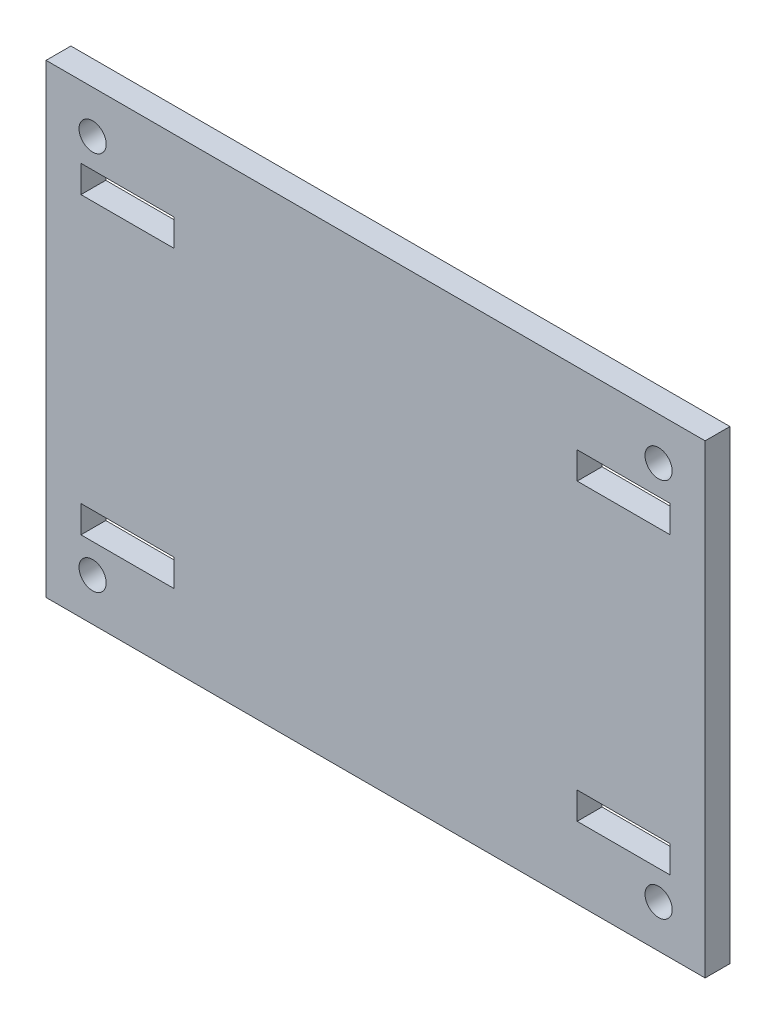
ISO-10303-21;
HEADER;
FILE_DESCRIPTION(('STEP AP214'),'2;1');
FILE_NAME('part.step','',(''),(''),'','','');
FILE_SCHEMA(('AUTOMOTIVE_DESIGN { 1 0 10303 214 1 1 1 1 }'));
ENDSEC;
DATA;
#1=APPLICATION_CONTEXT('core data for automotive mechanical design processes');
#2=APPLICATION_PROTOCOL_DEFINITION('international standard','automotive_design',2000,#1);
#3=PRODUCT_CONTEXT('',#1,'mechanical');
#4=PRODUCT('Part','Part','',(#3));
#5=PRODUCT_RELATED_PRODUCT_CATEGORY('part','',(#4));
#6=PRODUCT_DEFINITION_FORMATION('','',#4);
#7=PRODUCT_DEFINITION_CONTEXT('part definition',#1,'design');
#8=PRODUCT_DEFINITION('design','',#6,#7);
#9=PRODUCT_DEFINITION_SHAPE('','',#8);
#10=(LENGTH_UNIT() NAMED_UNIT(*) SI_UNIT(.MILLI.,.METRE.));
#11=(NAMED_UNIT(*) PLANE_ANGLE_UNIT() SI_UNIT($,.RADIAN.));
#12=(NAMED_UNIT(*) SI_UNIT($,.STERADIAN.) SOLID_ANGLE_UNIT());
#13=UNCERTAINTY_MEASURE_WITH_UNIT(LENGTH_MEASURE(1.E-05),#10,'distance_accuracy_value','');
#14=(GEOMETRIC_REPRESENTATION_CONTEXT(3) GLOBAL_UNCERTAINTY_ASSIGNED_CONTEXT((#13)) GLOBAL_UNIT_ASSIGNED_CONTEXT((#10,
#11,#12)) REPRESENTATION_CONTEXT('',''));
#15=CARTESIAN_POINT('',(0.,0.,0.));
#16=DIRECTION('',(0.,0.,1.));
#17=DIRECTION('',(1.,0.,0.));
#18=AXIS2_PLACEMENT_3D('',#15,#16,#17);
#19=CARTESIAN_POINT('',(0.,0.,3.2));
#20=DIRECTION('',(0.,0.,-1.));
#21=DIRECTION('',(-1.,0.,0.));
#22=AXIS2_PLACEMENT_3D('',#19,#20,#21);
#23=PLANE('',#22);
#24=DIRECTION('',(0.,-1.,0.));
#25=VECTOR('',#24,1.);
#26=CARTESIAN_POINT('',(-38.,-20.75,3.2));
#27=LINE('',#26,#25);
#28=CARTESIAN_POINT('',(-38.,-17.25,3.2));
#29=VERTEX_POINT('',#28);
#30=CARTESIAN_POINT('',(-38.,-20.75,3.2));
#31=VERTEX_POINT('',#30);
#32=EDGE_CURVE('E214',#29,#31,#27,.T.);
#33=ORIENTED_EDGE('',*,*,#32,.F.);
#34=DIRECTION('',(-1.,0.,0.));
#35=VECTOR('',#34,1.);
#36=CARTESIAN_POINT('',(-38.,-17.25,3.2));
#37=LINE('',#36,#35);
#38=CARTESIAN_POINT('',(-26.,-17.25,3.2));
#39=VERTEX_POINT('',#38);
#40=EDGE_CURVE('E223',#39,#29,#37,.T.);
#41=ORIENTED_EDGE('',*,*,#40,.F.);
#42=DIRECTION('',(0.,1.,0.));
#43=VECTOR('',#42,1.);
#44=CARTESIAN_POINT('',(-26.,-20.75,3.2));
#45=LINE('',#44,#43);
#46=CARTESIAN_POINT('',(-26.,-20.75,3.2));
#47=VERTEX_POINT('',#46);
#48=EDGE_CURVE('E217',#47,#39,#45,.T.);
#49=ORIENTED_EDGE('',*,*,#48,.F.);
#50=DIRECTION('',(1.,0.,0.));
#51=VECTOR('',#50,1.);
#52=CARTESIAN_POINT('',(-38.,-20.75,3.2));
#53=LINE('',#52,#51);
#54=EDGE_CURVE('E220',#31,#47,#53,.T.);
#55=ORIENTED_EDGE('',*,*,#54,.F.);
#56=EDGE_LOOP('',(#33,#41,#49,#55));
#57=FACE_BOUND('',#56,.T.);
#58=DIRECTION('',(0.,-1.,0.));
#59=VECTOR('',#58,1.);
#60=CARTESIAN_POINT('',(-38.,17.25,3.2));
#61=LINE('',#60,#59);
#62=CARTESIAN_POINT('',(-38.,20.75,3.2));
#63=VERTEX_POINT('',#62);
#64=CARTESIAN_POINT('',(-38.,17.25,3.2));
#65=VERTEX_POINT('',#64);
#66=EDGE_CURVE('E280',#63,#65,#61,.T.);
#67=ORIENTED_EDGE('',*,*,#66,.F.);
#68=DIRECTION('',(-1.,0.,0.));
#69=VECTOR('',#68,1.);
#70=CARTESIAN_POINT('',(-38.,20.75,3.2));
#71=LINE('',#70,#69);
#72=CARTESIAN_POINT('',(-26.,20.75,3.2));
#73=VERTEX_POINT('',#72);
#74=EDGE_CURVE('E283',#73,#63,#71,.T.);
#75=ORIENTED_EDGE('',*,*,#74,.F.);
#76=DIRECTION('',(0.,1.,0.));
#77=VECTOR('',#76,1.);
#78=CARTESIAN_POINT('',(-26.,17.25,3.2));
#79=LINE('',#78,#77);
#80=CARTESIAN_POINT('',(-26.,17.25,3.2));
#81=VERTEX_POINT('',#80);
#82=EDGE_CURVE('E285',#81,#73,#79,.T.);
#83=ORIENTED_EDGE('',*,*,#82,.F.);
#84=DIRECTION('',(1.,0.,0.));
#85=VECTOR('',#84,1.);
#86=CARTESIAN_POINT('',(-38.,17.25,3.2));
#87=LINE('',#86,#85);
#88=EDGE_CURVE('E278',#65,#81,#87,.T.);
#89=ORIENTED_EDGE('',*,*,#88,.F.);
#90=EDGE_LOOP('',(#67,#75,#83,#89));
#91=FACE_BOUND('',#90,.T.);
#92=DIRECTION('',(0.,-1.,0.));
#93=VECTOR('',#92,1.);
#94=CARTESIAN_POINT('',(-42.5,-30.,3.2));
#95=LINE('',#94,#93);
#96=CARTESIAN_POINT('',(-42.5,30.,3.2));
#97=VERTEX_POINT('',#96);
#98=CARTESIAN_POINT('',(-42.5,-30.,3.2));
#99=VERTEX_POINT('',#98);
#100=EDGE_CURVE('E306',#97,#99,#95,.T.);
#101=ORIENTED_EDGE('',*,*,#100,.T.);
#102=DIRECTION('',(1.,0.,0.));
#103=VECTOR('',#102,1.);
#104=CARTESIAN_POINT('',(-42.5,-30.,3.2));
#105=LINE('',#104,#103);
#106=CARTESIAN_POINT('',(42.5,-30.,3.2));
#107=VERTEX_POINT('',#106);
#108=EDGE_CURVE('E311',#99,#107,#105,.T.);
#109=ORIENTED_EDGE('',*,*,#108,.T.);
#110=DIRECTION('',(0.,1.,0.));
#111=VECTOR('',#110,1.);
#112=CARTESIAN_POINT('',(42.5,-30.,3.2));
#113=LINE('',#112,#111);
#114=CARTESIAN_POINT('',(42.5,30.,3.2));
#115=VERTEX_POINT('',#114);
#116=EDGE_CURVE('E312',#107,#115,#113,.T.);
#117=ORIENTED_EDGE('',*,*,#116,.T.);
#118=DIRECTION('',(-1.,0.,0.));
#119=VECTOR('',#118,1.);
#120=CARTESIAN_POINT('',(-42.5,30.,3.2));
#121=LINE('',#120,#119);
#122=EDGE_CURVE('E316',#115,#97,#121,.T.);
#123=ORIENTED_EDGE('',*,*,#122,.T.);
#124=EDGE_LOOP('',(#101,#109,#117,#123));
#125=FACE_BOUND('',#124,.T.);
#126=DIRECTION('',(0.,-1.,0.));
#127=VECTOR('',#126,1.);
#128=CARTESIAN_POINT('',(26.,17.25,3.2));
#129=LINE('',#128,#127);
#130=CARTESIAN_POINT('',(26.,20.75,3.2));
#131=VERTEX_POINT('',#130);
#132=CARTESIAN_POINT('',(26.,17.25,3.2));
#133=VERTEX_POINT('',#132);
#134=EDGE_CURVE('E247',#131,#133,#129,.T.);
#135=ORIENTED_EDGE('',*,*,#134,.F.);
#136=DIRECTION('',(-1.,0.,0.));
#137=VECTOR('',#136,1.);
#138=CARTESIAN_POINT('',(26.,20.75,3.2));
#139=LINE('',#138,#137);
#140=CARTESIAN_POINT('',(38.,20.75,3.2));
#141=VERTEX_POINT('',#140);
#142=EDGE_CURVE('E253',#141,#131,#139,.T.);
#143=ORIENTED_EDGE('',*,*,#142,.F.);
#144=DIRECTION('',(0.,1.,0.));
#145=VECTOR('',#144,1.);
#146=CARTESIAN_POINT('',(38.,17.25,3.2));
#147=LINE('',#146,#145);
#148=CARTESIAN_POINT('',(38.,17.25,3.2));
#149=VERTEX_POINT('',#148);
#150=EDGE_CURVE('E251',#149,#141,#147,.T.);
#151=ORIENTED_EDGE('',*,*,#150,.F.);
#152=DIRECTION('',(1.,0.,0.));
#153=VECTOR('',#152,1.);
#154=CARTESIAN_POINT('',(26.,17.25,3.2));
#155=LINE('',#154,#153);
#156=EDGE_CURVE('E246',#133,#149,#155,.T.);
#157=ORIENTED_EDGE('',*,*,#156,.F.);
#158=EDGE_LOOP('',(#135,#143,#151,#157));
#159=FACE_BOUND('',#158,.T.);
#160=DIRECTION('',(0.,-1.,0.));
#161=VECTOR('',#160,1.);
#162=CARTESIAN_POINT('',(26.,-20.75,3.2));
#163=LINE('',#162,#161);
#164=CARTESIAN_POINT('',(26.,-17.25,3.2));
#165=VERTEX_POINT('',#164);
#166=CARTESIAN_POINT('',(26.,-20.75,3.2));
#167=VERTEX_POINT('',#166);
#168=EDGE_CURVE('E176',#165,#167,#163,.T.);
#169=ORIENTED_EDGE('',*,*,#168,.F.);
#170=DIRECTION('',(-1.,0.,0.));
#171=VECTOR('',#170,1.);
#172=CARTESIAN_POINT('',(26.,-17.25,3.2));
#173=LINE('',#172,#171);
#174=CARTESIAN_POINT('',(38.,-17.25,3.2));
#175=VERTEX_POINT('',#174);
#176=EDGE_CURVE('E198',#175,#165,#173,.T.);
#177=ORIENTED_EDGE('',*,*,#176,.F.);
#178=DIRECTION('',(0.,1.,0.));
#179=VECTOR('',#178,1.);
#180=CARTESIAN_POINT('',(38.,-20.75,3.2));
#181=LINE('',#180,#179);
#182=CARTESIAN_POINT('',(38.,-20.75,3.2));
#183=VERTEX_POINT('',#182);
#184=EDGE_CURVE('E197',#183,#175,#181,.T.);
#185=ORIENTED_EDGE('',*,*,#184,.F.);
#186=DIRECTION('',(1.,0.,0.));
#187=VECTOR('',#186,1.);
#188=CARTESIAN_POINT('',(26.,-20.75,3.2));
#189=LINE('',#188,#187);
#190=EDGE_CURVE('E182',#167,#183,#189,.T.);
#191=ORIENTED_EDGE('',*,*,#190,.F.);
#192=EDGE_LOOP('',(#169,#177,#185,#191));
#193=FACE_BOUND('',#192,.T.);
#194=CARTESIAN_POINT('',(-36.5,-24.5,3.2));
#195=DIRECTION('',(0.,0.,1.));
#196=DIRECTION('',(1.,0.,0.));
#197=AXIS2_PLACEMENT_3D('',#194,#195,#196);
#198=CIRCLE('',#197,1.75);
#199=CARTESIAN_POINT('',(-34.75,-24.5,3.2));
#200=VERTEX_POINT('',#199);
#201=EDGE_CURVE('E203',#200,#200,#198,.T.);
#202=ORIENTED_EDGE('',*,*,#201,.F.);
#203=EDGE_LOOP('',(#202));
#204=FACE_BOUND('',#203,.T.);
#205=CARTESIAN_POINT('',(36.5,-24.5,3.2));
#206=DIRECTION('',(0.,0.,1.));
#207=DIRECTION('',(1.,0.,0.));
#208=AXIS2_PLACEMENT_3D('',#205,#206,#207);
#209=CIRCLE('',#208,1.75);
#210=CARTESIAN_POINT('',(38.25,-24.5,3.2));
#211=VERTEX_POINT('',#210);
#212=EDGE_CURVE('E482',#211,#211,#209,.T.);
#213=ORIENTED_EDGE('',*,*,#212,.F.);
#214=EDGE_LOOP('',(#213));
#215=FACE_BOUND('',#214,.T.);
#216=CARTESIAN_POINT('',(-36.5,24.5,3.2));
#217=DIRECTION('',(0.,0.,1.));
#218=DIRECTION('',(1.,0.,0.));
#219=AXIS2_PLACEMENT_3D('',#216,#217,#218);
#220=CIRCLE('',#219,1.75);
#221=CARTESIAN_POINT('',(-34.75,24.5,3.2));
#222=VERTEX_POINT('',#221);
#223=EDGE_CURVE('E476',#222,#222,#220,.T.);
#224=ORIENTED_EDGE('',*,*,#223,.F.);
#225=EDGE_LOOP('',(#224));
#226=FACE_BOUND('',#225,.T.);
#227=CARTESIAN_POINT('',(36.5,24.5,3.2));
#228=DIRECTION('',(0.,0.,1.));
#229=DIRECTION('',(1.,0.,0.));
#230=AXIS2_PLACEMENT_3D('',#227,#228,#229);
#231=CIRCLE('',#230,1.75);
#232=CARTESIAN_POINT('',(38.25,24.5,3.2));
#233=VERTEX_POINT('',#232);
#234=EDGE_CURVE('E467',#233,#233,#231,.T.);
#235=ORIENTED_EDGE('',*,*,#234,.F.);
#236=EDGE_LOOP('',(#235));
#237=FACE_BOUND('',#236,.T.);
#238=ADVANCED_FACE('F39',(#57,#91,#125,#159,#193,#204,#215,#226,#237),#23,.F.);
#239=CARTESIAN_POINT('',(0.,0.,0.));
#240=DIRECTION('',(0.,0.,-1.));
#241=DIRECTION('',(-1.,0.,0.));
#242=AXIS2_PLACEMENT_3D('',#239,#240,#241);
#243=PLANE('',#242);
#244=CARTESIAN_POINT('',(-36.5,24.5,0.));
#245=DIRECTION('',(0.,0.,1.));
#246=DIRECTION('',(1.,0.,0.));
#247=AXIS2_PLACEMENT_3D('',#244,#245,#246);
#248=CIRCLE('',#247,1.75);
#249=CARTESIAN_POINT('',(-34.75,24.5,0.));
#250=VERTEX_POINT('',#249);
#251=EDGE_CURVE('E471',#250,#250,#248,.T.);
#252=ORIENTED_EDGE('',*,*,#251,.T.);
#253=EDGE_LOOP('',(#252));
#254=FACE_BOUND('',#253,.T.);
#255=CARTESIAN_POINT('',(-36.5,-24.5,0.));
#256=DIRECTION('',(0.,0.,1.));
#257=DIRECTION('',(1.,0.,0.));
#258=AXIS2_PLACEMENT_3D('',#255,#256,#257);
#259=CIRCLE('',#258,1.75);
#260=CARTESIAN_POINT('',(-34.75,-24.5,0.));
#261=VERTEX_POINT('',#260);
#262=EDGE_CURVE('E484',#261,#261,#259,.T.);
#263=ORIENTED_EDGE('',*,*,#262,.T.);
#264=EDGE_LOOP('',(#263));
#265=FACE_BOUND('',#264,.T.);
#266=DIRECTION('',(0.,-1.,0.));
#267=VECTOR('',#266,1.);
#268=CARTESIAN_POINT('',(-42.5,-30.,0.));
#269=LINE('',#268,#267);
#270=CARTESIAN_POINT('',(-42.5,30.,0.));
#271=VERTEX_POINT('',#270);
#272=CARTESIAN_POINT('',(-42.5,-30.,0.));
#273=VERTEX_POINT('',#272);
#274=EDGE_CURVE('E310',#271,#273,#269,.T.);
#275=ORIENTED_EDGE('',*,*,#274,.F.);
#276=DIRECTION('',(-1.,0.,0.));
#277=VECTOR('',#276,1.);
#278=CARTESIAN_POINT('',(-42.5,30.,0.));
#279=LINE('',#278,#277);
#280=CARTESIAN_POINT('',(42.5,30.,0.));
#281=VERTEX_POINT('',#280);
#282=EDGE_CURVE('E315',#281,#271,#279,.T.);
#283=ORIENTED_EDGE('',*,*,#282,.F.);
#284=DIRECTION('',(0.,1.,0.));
#285=VECTOR('',#284,1.);
#286=CARTESIAN_POINT('',(42.5,-30.,0.));
#287=LINE('',#286,#285);
#288=CARTESIAN_POINT('',(42.5,-30.,0.));
#289=VERTEX_POINT('',#288);
#290=EDGE_CURVE('E322',#289,#281,#287,.T.);
#291=ORIENTED_EDGE('',*,*,#290,.F.);
#292=DIRECTION('',(1.,0.,0.));
#293=VECTOR('',#292,1.);
#294=CARTESIAN_POINT('',(-42.5,-30.,0.));
#295=LINE('',#294,#293);
#296=EDGE_CURVE('E321',#273,#289,#295,.T.);
#297=ORIENTED_EDGE('',*,*,#296,.F.);
#298=EDGE_LOOP('',(#275,#283,#291,#297));
#299=FACE_BOUND('',#298,.T.);
#300=DIRECTION('',(-1.,0.,0.));
#301=VECTOR('',#300,1.);
#302=CARTESIAN_POINT('',(-38.,20.75,0.));
#303=LINE('',#302,#301);
#304=CARTESIAN_POINT('',(-26.,20.75,0.));
#305=VERTEX_POINT('',#304);
#306=CARTESIAN_POINT('',(-38.,20.75,0.));
#307=VERTEX_POINT('',#306);
#308=EDGE_CURVE('E279',#305,#307,#303,.T.);
#309=ORIENTED_EDGE('',*,*,#308,.T.);
#310=DIRECTION('',(0.,-1.,0.));
#311=VECTOR('',#310,1.);
#312=CARTESIAN_POINT('',(-38.,17.25,0.));
#313=LINE('',#312,#311);
#314=CARTESIAN_POINT('',(-38.,17.25,0.));
#315=VERTEX_POINT('',#314);
#316=EDGE_CURVE('E276',#307,#315,#313,.T.);
#317=ORIENTED_EDGE('',*,*,#316,.T.);
#318=DIRECTION('',(1.,0.,0.));
#319=VECTOR('',#318,1.);
#320=CARTESIAN_POINT('',(-38.,17.25,0.));
#321=LINE('',#320,#319);
#322=CARTESIAN_POINT('',(-26.,17.25,0.));
#323=VERTEX_POINT('',#322);
#324=EDGE_CURVE('E290',#315,#323,#321,.T.);
#325=ORIENTED_EDGE('',*,*,#324,.T.);
#326=DIRECTION('',(0.,1.,0.));
#327=VECTOR('',#326,1.);
#328=CARTESIAN_POINT('',(-26.,17.25,0.));
#329=LINE('',#328,#327);
#330=EDGE_CURVE('E291',#323,#305,#329,.T.);
#331=ORIENTED_EDGE('',*,*,#330,.T.);
#332=EDGE_LOOP('',(#309,#317,#325,#331));
#333=FACE_BOUND('',#332,.T.);
#334=DIRECTION('',(-1.,0.,0.));
#335=VECTOR('',#334,1.);
#336=CARTESIAN_POINT('',(26.,20.75,0.));
#337=LINE('',#336,#335);
#338=CARTESIAN_POINT('',(38.,20.75,0.));
#339=VERTEX_POINT('',#338);
#340=CARTESIAN_POINT('',(26.,20.75,0.));
#341=VERTEX_POINT('',#340);
#342=EDGE_CURVE('E249',#339,#341,#337,.T.);
#343=ORIENTED_EDGE('',*,*,#342,.T.);
#344=DIRECTION('',(0.,-1.,0.));
#345=VECTOR('',#344,1.);
#346=CARTESIAN_POINT('',(26.,17.25,0.));
#347=LINE('',#346,#345);
#348=CARTESIAN_POINT('',(26.,17.25,0.));
#349=VERTEX_POINT('',#348);
#350=EDGE_CURVE('E245',#341,#349,#347,.T.);
#351=ORIENTED_EDGE('',*,*,#350,.T.);
#352=DIRECTION('',(1.,0.,0.));
#353=VECTOR('',#352,1.);
#354=CARTESIAN_POINT('',(26.,17.25,0.));
#355=LINE('',#354,#353);
#356=CARTESIAN_POINT('',(38.,17.25,0.));
#357=VERTEX_POINT('',#356);
#358=EDGE_CURVE('E260',#349,#357,#355,.T.);
#359=ORIENTED_EDGE('',*,*,#358,.T.);
#360=DIRECTION('',(0.,1.,0.));
#361=VECTOR('',#360,1.);
#362=CARTESIAN_POINT('',(38.,17.25,0.));
#363=LINE('',#362,#361);
#364=EDGE_CURVE('E265',#357,#339,#363,.T.);
#365=ORIENTED_EDGE('',*,*,#364,.T.);
#366=EDGE_LOOP('',(#343,#351,#359,#365));
#367=FACE_BOUND('',#366,.T.);
#368=DIRECTION('',(-1.,0.,0.));
#369=VECTOR('',#368,1.);
#370=CARTESIAN_POINT('',(-38.,-17.25,0.));
#371=LINE('',#370,#369);
#372=CARTESIAN_POINT('',(-26.,-17.25,0.));
#373=VERTEX_POINT('',#372);
#374=CARTESIAN_POINT('',(-38.,-17.25,0.));
#375=VERTEX_POINT('',#374);
#376=EDGE_CURVE('E216',#373,#375,#371,.T.);
#377=ORIENTED_EDGE('',*,*,#376,.T.);
#378=DIRECTION('',(0.,-1.,0.));
#379=VECTOR('',#378,1.);
#380=CARTESIAN_POINT('',(-38.,-20.75,0.));
#381=LINE('',#380,#379);
#382=CARTESIAN_POINT('',(-38.,-20.75,0.));
#383=VERTEX_POINT('',#382);
#384=EDGE_CURVE('E195',#375,#383,#381,.T.);
#385=ORIENTED_EDGE('',*,*,#384,.T.);
#386=DIRECTION('',(1.,0.,0.));
#387=VECTOR('',#386,1.);
#388=CARTESIAN_POINT('',(-38.,-20.75,0.));
#389=LINE('',#388,#387);
#390=CARTESIAN_POINT('',(-26.,-20.75,0.));
#391=VERTEX_POINT('',#390);
#392=EDGE_CURVE('E228',#383,#391,#389,.T.);
#393=ORIENTED_EDGE('',*,*,#392,.T.);
#394=DIRECTION('',(0.,1.,0.));
#395=VECTOR('',#394,1.);
#396=CARTESIAN_POINT('',(-26.,-20.75,0.));
#397=LINE('',#396,#395);
#398=EDGE_CURVE('E231',#391,#373,#397,.T.);
#399=ORIENTED_EDGE('',*,*,#398,.T.);
#400=EDGE_LOOP('',(#377,#385,#393,#399));
#401=FACE_BOUND('',#400,.T.);
#402=DIRECTION('',(-1.,0.,0.));
#403=VECTOR('',#402,1.);
#404=CARTESIAN_POINT('',(26.,-17.25,0.));
#405=LINE('',#404,#403);
#406=CARTESIAN_POINT('',(38.,-17.25,0.));
#407=VERTEX_POINT('',#406);
#408=CARTESIAN_POINT('',(26.,-17.25,0.));
#409=VERTEX_POINT('',#408);
#410=EDGE_CURVE('E184',#407,#409,#405,.T.);
#411=ORIENTED_EDGE('',*,*,#410,.T.);
#412=DIRECTION('',(0.,-1.,0.));
#413=VECTOR('',#412,1.);
#414=CARTESIAN_POINT('',(26.,-20.75,0.));
#415=LINE('',#414,#413);
#416=CARTESIAN_POINT('',(26.,-20.75,0.));
#417=VERTEX_POINT('',#416);
#418=EDGE_CURVE('E62',#409,#417,#415,.T.);
#419=ORIENTED_EDGE('',*,*,#418,.T.);
#420=DIRECTION('',(1.,0.,0.));
#421=VECTOR('',#420,1.);
#422=CARTESIAN_POINT('',(26.,-20.75,0.));
#423=LINE('',#422,#421);
#424=CARTESIAN_POINT('',(38.,-20.75,0.));
#425=VERTEX_POINT('',#424);
#426=EDGE_CURVE('E192',#417,#425,#423,.T.);
#427=ORIENTED_EDGE('',*,*,#426,.T.);
#428=DIRECTION('',(0.,1.,0.));
#429=VECTOR('',#428,1.);
#430=CARTESIAN_POINT('',(38.,-20.75,0.));
#431=LINE('',#430,#429);
#432=EDGE_CURVE('E207',#425,#407,#431,.T.);
#433=ORIENTED_EDGE('',*,*,#432,.T.);
#434=EDGE_LOOP('',(#411,#419,#427,#433));
#435=FACE_BOUND('',#434,.T.);
#436=CARTESIAN_POINT('',(36.5,-24.5,0.));
#437=DIRECTION('',(0.,0.,1.));
#438=DIRECTION('',(1.,0.,0.));
#439=AXIS2_PLACEMENT_3D('',#436,#437,#438);
#440=CIRCLE('',#439,1.75);
#441=CARTESIAN_POINT('',(38.25,-24.5,0.));
#442=VERTEX_POINT('',#441);
#443=EDGE_CURVE('E478',#442,#442,#440,.T.);
#444=ORIENTED_EDGE('',*,*,#443,.T.);
#445=EDGE_LOOP('',(#444));
#446=FACE_BOUND('',#445,.T.);
#447=CARTESIAN_POINT('',(36.5,24.5,0.));
#448=DIRECTION('',(0.,0.,1.));
#449=DIRECTION('',(1.,0.,0.));
#450=AXIS2_PLACEMENT_3D('',#447,#448,#449);
#451=CIRCLE('',#450,1.75);
#452=CARTESIAN_POINT('',(38.25,24.5,0.));
#453=VERTEX_POINT('',#452);
#454=EDGE_CURVE('E470',#453,#453,#451,.T.);
#455=ORIENTED_EDGE('',*,*,#454,.T.);
#456=EDGE_LOOP('',(#455));
#457=FACE_BOUND('',#456,.T.);
#458=ADVANCED_FACE('F341',(#254,#265,#299,#333,#367,#401,#435,#446,#457),#243,.T.);
#459=CARTESIAN_POINT('',(-42.5,-30.,3.2));
#460=DIRECTION('',(1.,0.,0.));
#461=DIRECTION('',(0.,0.,-1.));
#462=AXIS2_PLACEMENT_3D('',#459,#460,#461);
#463=PLANE('',#462);
#464=ORIENTED_EDGE('',*,*,#274,.T.);
#465=DIRECTION('',(0.,0.,-1.));
#466=VECTOR('',#465,1.);
#467=CARTESIAN_POINT('',(-42.5,-30.,3.2));
#468=LINE('',#467,#466);
#469=EDGE_CURVE('E11',#99,#273,#468,.T.);
#470=ORIENTED_EDGE('',*,*,#469,.F.);
#471=ORIENTED_EDGE('',*,*,#100,.F.);
#472=DIRECTION('',(0.,0.,-1.));
#473=VECTOR('',#472,1.);
#474=CARTESIAN_POINT('',(-42.5,30.,3.2));
#475=LINE('',#474,#473);
#476=EDGE_CURVE('E318',#97,#271,#475,.T.);
#477=ORIENTED_EDGE('',*,*,#476,.T.);
#478=EDGE_LOOP('',(#464,#470,#471,#477));
#479=FACE_BOUND('',#478,.T.);
#480=ADVANCED_FACE('F41',(#479),#463,.F.);
#481=CARTESIAN_POINT('',(-42.5,-30.,3.2));
#482=DIRECTION('',(0.,1.,0.));
#483=DIRECTION('',(0.,0.,1.));
#484=AXIS2_PLACEMENT_3D('',#481,#482,#483);
#485=PLANE('',#484);
#486=ORIENTED_EDGE('',*,*,#296,.T.);
#487=DIRECTION('',(0.,0.,-1.));
#488=VECTOR('',#487,1.);
#489=CARTESIAN_POINT('',(42.5,-30.,3.2));
#490=LINE('',#489,#488);
#491=EDGE_CURVE('E50',#107,#289,#490,.T.);
#492=ORIENTED_EDGE('',*,*,#491,.F.);
#493=ORIENTED_EDGE('',*,*,#108,.F.);
#494=ORIENTED_EDGE('',*,*,#469,.T.);
#495=EDGE_LOOP('',(#486,#492,#493,#494));
#496=FACE_BOUND('',#495,.T.);
#497=ADVANCED_FACE('F355',(#496),#485,.F.);
#498=CARTESIAN_POINT('',(42.5,-30.,3.2));
#499=DIRECTION('',(-1.,0.,0.));
#500=DIRECTION('',(0.,0.,1.));
#501=AXIS2_PLACEMENT_3D('',#498,#499,#500);
#502=PLANE('',#501);
#503=ORIENTED_EDGE('',*,*,#290,.T.);
#504=DIRECTION('',(0.,0.,-1.));
#505=VECTOR('',#504,1.);
#506=CARTESIAN_POINT('',(42.5,30.,3.2));
#507=LINE('',#506,#505);
#508=EDGE_CURVE('E329',#115,#281,#507,.T.);
#509=ORIENTED_EDGE('',*,*,#508,.F.);
#510=ORIENTED_EDGE('',*,*,#116,.F.);
#511=ORIENTED_EDGE('',*,*,#491,.T.);
#512=EDGE_LOOP('',(#503,#509,#510,#511));
#513=FACE_BOUND('',#512,.T.);
#514=ADVANCED_FACE('F335',(#513),#502,.F.);
#515=CARTESIAN_POINT('',(-42.5,30.,3.2));
#516=DIRECTION('',(0.,-1.,0.));
#517=DIRECTION('',(0.,0.,-1.));
#518=AXIS2_PLACEMENT_3D('',#515,#516,#517);
#519=PLANE('',#518);
#520=ORIENTED_EDGE('',*,*,#282,.T.);
#521=ORIENTED_EDGE('',*,*,#476,.F.);
#522=ORIENTED_EDGE('',*,*,#122,.F.);
#523=ORIENTED_EDGE('',*,*,#508,.T.);
#524=EDGE_LOOP('',(#520,#521,#522,#523));
#525=FACE_BOUND('',#524,.T.);
#526=ADVANCED_FACE('F345',(#525),#519,.F.);
#527=CARTESIAN_POINT('',(-38.,17.25,3.2));
#528=DIRECTION('',(1.,0.,0.));
#529=DIRECTION('',(0.,0.,-1.));
#530=AXIS2_PLACEMENT_3D('',#527,#528,#529);
#531=PLANE('',#530);
#532=ORIENTED_EDGE('',*,*,#316,.F.);
#533=DIRECTION('',(0.,0.,-1.));
#534=VECTOR('',#533,1.);
#535=CARTESIAN_POINT('',(-38.,20.75,3.2));
#536=LINE('',#535,#534);
#537=EDGE_CURVE('E287',#63,#307,#536,.T.);
#538=ORIENTED_EDGE('',*,*,#537,.F.);
#539=ORIENTED_EDGE('',*,*,#66,.T.);
#540=DIRECTION('',(0.,0.,-1.));
#541=VECTOR('',#540,1.);
#542=CARTESIAN_POINT('',(-38.,17.25,3.2));
#543=LINE('',#542,#541);
#544=EDGE_CURVE('E305',#65,#315,#543,.T.);
#545=ORIENTED_EDGE('',*,*,#544,.T.);
#546=EDGE_LOOP('',(#532,#538,#539,#545));
#547=FACE_BOUND('',#546,.T.);
#548=ADVANCED_FACE('F369',(#547),#531,.T.);
#549=CARTESIAN_POINT('',(-38.,17.25,3.2));
#550=DIRECTION('',(0.,1.,0.));
#551=DIRECTION('',(0.,0.,1.));
#552=AXIS2_PLACEMENT_3D('',#549,#550,#551);
#553=PLANE('',#552);
#554=ORIENTED_EDGE('',*,*,#324,.F.);
#555=ORIENTED_EDGE('',*,*,#544,.F.);
#556=ORIENTED_EDGE('',*,*,#88,.T.);
#557=DIRECTION('',(0.,0.,-1.));
#558=VECTOR('',#557,1.);
#559=CARTESIAN_POINT('',(-26.,17.25,3.2));
#560=LINE('',#559,#558);
#561=EDGE_CURVE('E302',#81,#323,#560,.T.);
#562=ORIENTED_EDGE('',*,*,#561,.T.);
#563=EDGE_LOOP('',(#554,#555,#556,#562));
#564=FACE_BOUND('',#563,.T.);
#565=ADVANCED_FACE('F377',(#564),#553,.T.);
#566=CARTESIAN_POINT('',(-26.,17.25,3.2));
#567=DIRECTION('',(-1.,0.,0.));
#568=DIRECTION('',(0.,0.,1.));
#569=AXIS2_PLACEMENT_3D('',#566,#567,#568);
#570=PLANE('',#569);
#571=ORIENTED_EDGE('',*,*,#330,.F.);
#572=ORIENTED_EDGE('',*,*,#561,.F.);
#573=ORIENTED_EDGE('',*,*,#82,.T.);
#574=DIRECTION('',(0.,0.,-1.));
#575=VECTOR('',#574,1.);
#576=CARTESIAN_POINT('',(-26.,20.75,3.2));
#577=LINE('',#576,#575);
#578=EDGE_CURVE('E300',#73,#305,#577,.T.);
#579=ORIENTED_EDGE('',*,*,#578,.T.);
#580=EDGE_LOOP('',(#571,#572,#573,#579));
#581=FACE_BOUND('',#580,.T.);
#582=ADVANCED_FACE('F385',(#581),#570,.T.);
#583=CARTESIAN_POINT('',(-38.,20.75,3.2));
#584=DIRECTION('',(0.,-1.,0.));
#585=DIRECTION('',(0.,0.,-1.));
#586=AXIS2_PLACEMENT_3D('',#583,#584,#585);
#587=PLANE('',#586);
#588=ORIENTED_EDGE('',*,*,#308,.F.);
#589=ORIENTED_EDGE('',*,*,#578,.F.);
#590=ORIENTED_EDGE('',*,*,#74,.T.);
#591=ORIENTED_EDGE('',*,*,#537,.T.);
#592=EDGE_LOOP('',(#588,#589,#590,#591));
#593=FACE_BOUND('',#592,.T.);
#594=ADVANCED_FACE('F388',(#593),#587,.T.);
#595=CARTESIAN_POINT('',(26.,17.25,3.2));
#596=DIRECTION('',(1.,0.,0.));
#597=DIRECTION('',(0.,0.,-1.));
#598=AXIS2_PLACEMENT_3D('',#595,#596,#597);
#599=PLANE('',#598);
#600=ORIENTED_EDGE('',*,*,#350,.F.);
#601=DIRECTION('',(0.,0.,-1.));
#602=VECTOR('',#601,1.);
#603=CARTESIAN_POINT('',(26.,20.75,3.2));
#604=LINE('',#603,#602);
#605=EDGE_CURVE('E258',#131,#341,#604,.T.);
#606=ORIENTED_EDGE('',*,*,#605,.F.);
#607=ORIENTED_EDGE('',*,*,#134,.T.);
#608=DIRECTION('',(0.,0.,-1.));
#609=VECTOR('',#608,1.);
#610=CARTESIAN_POINT('',(26.,17.25,3.2));
#611=LINE('',#610,#609);
#612=EDGE_CURVE('E273',#133,#349,#611,.T.);
#613=ORIENTED_EDGE('',*,*,#612,.T.);
#614=EDGE_LOOP('',(#600,#606,#607,#613));
#615=FACE_BOUND('',#614,.T.);
#616=ADVANCED_FACE('F405',(#615),#599,.T.);
#617=CARTESIAN_POINT('',(26.,17.25,3.2));
#618=DIRECTION('',(0.,1.,0.));
#619=DIRECTION('',(0.,0.,1.));
#620=AXIS2_PLACEMENT_3D('',#617,#618,#619);
#621=PLANE('',#620);
#622=ORIENTED_EDGE('',*,*,#358,.F.);
#623=ORIENTED_EDGE('',*,*,#612,.F.);
#624=ORIENTED_EDGE('',*,*,#156,.T.);
#625=DIRECTION('',(0.,0.,-1.));
#626=VECTOR('',#625,1.);
#627=CARTESIAN_POINT('',(38.,17.25,3.2));
#628=LINE('',#627,#626);
#629=EDGE_CURVE('E271',#149,#357,#628,.T.);
#630=ORIENTED_EDGE('',*,*,#629,.T.);
#631=EDGE_LOOP('',(#622,#623,#624,#630));
#632=FACE_BOUND('',#631,.T.);
#633=ADVANCED_FACE('F410',(#632),#621,.T.);
#634=CARTESIAN_POINT('',(38.,17.25,3.2));
#635=DIRECTION('',(-1.,0.,0.));
#636=DIRECTION('',(0.,0.,1.));
#637=AXIS2_PLACEMENT_3D('',#634,#635,#636);
#638=PLANE('',#637);
#639=ORIENTED_EDGE('',*,*,#364,.F.);
#640=ORIENTED_EDGE('',*,*,#629,.F.);
#641=ORIENTED_EDGE('',*,*,#150,.T.);
#642=DIRECTION('',(0.,0.,-1.));
#643=VECTOR('',#642,1.);
#644=CARTESIAN_POINT('',(38.,20.75,3.2));
#645=LINE('',#644,#643);
#646=EDGE_CURVE('E267',#141,#339,#645,.T.);
#647=ORIENTED_EDGE('',*,*,#646,.T.);
#648=EDGE_LOOP('',(#639,#640,#641,#647));
#649=FACE_BOUND('',#648,.T.);
#650=ADVANCED_FACE('F411',(#649),#638,.T.);
#651=CARTESIAN_POINT('',(26.,20.75,3.2));
#652=DIRECTION('',(0.,-1.,0.));
#653=DIRECTION('',(0.,0.,-1.));
#654=AXIS2_PLACEMENT_3D('',#651,#652,#653);
#655=PLANE('',#654);
#656=ORIENTED_EDGE('',*,*,#342,.F.);
#657=ORIENTED_EDGE('',*,*,#646,.F.);
#658=ORIENTED_EDGE('',*,*,#142,.T.);
#659=ORIENTED_EDGE('',*,*,#605,.T.);
#660=EDGE_LOOP('',(#656,#657,#658,#659));
#661=FACE_BOUND('',#660,.T.);
#662=ADVANCED_FACE('F414',(#661),#655,.T.);
#663=CARTESIAN_POINT('',(-38.,-20.75,3.2));
#664=DIRECTION('',(1.,0.,0.));
#665=DIRECTION('',(0.,0.,-1.));
#666=AXIS2_PLACEMENT_3D('',#663,#664,#665);
#667=PLANE('',#666);
#668=ORIENTED_EDGE('',*,*,#384,.F.);
#669=DIRECTION('',(0.,0.,-1.));
#670=VECTOR('',#669,1.);
#671=CARTESIAN_POINT('',(-38.,-17.25,3.2));
#672=LINE('',#671,#670);
#673=EDGE_CURVE('E224',#29,#375,#672,.T.);
#674=ORIENTED_EDGE('',*,*,#673,.F.);
#675=ORIENTED_EDGE('',*,*,#32,.T.);
#676=DIRECTION('',(0.,0.,-1.));
#677=VECTOR('',#676,1.);
#678=CARTESIAN_POINT('',(-38.,-20.75,3.2));
#679=LINE('',#678,#677);
#680=EDGE_CURVE('E242',#31,#383,#679,.T.);
#681=ORIENTED_EDGE('',*,*,#680,.T.);
#682=EDGE_LOOP('',(#668,#674,#675,#681));
#683=FACE_BOUND('',#682,.T.);
#684=ADVANCED_FACE('F416',(#683),#667,.T.);
#685=CARTESIAN_POINT('',(-38.,-20.75,3.2));
#686=DIRECTION('',(0.,1.,0.));
#687=DIRECTION('',(0.,0.,1.));
#688=AXIS2_PLACEMENT_3D('',#685,#686,#687);
#689=PLANE('',#688);
#690=ORIENTED_EDGE('',*,*,#392,.F.);
#691=ORIENTED_EDGE('',*,*,#680,.F.);
#692=ORIENTED_EDGE('',*,*,#54,.T.);
#693=DIRECTION('',(0.,0.,-1.));
#694=VECTOR('',#693,1.);
#695=CARTESIAN_POINT('',(-26.,-20.75,3.2));
#696=LINE('',#695,#694);
#697=EDGE_CURVE('E238',#47,#391,#696,.T.);
#698=ORIENTED_EDGE('',*,*,#697,.T.);
#699=EDGE_LOOP('',(#690,#691,#692,#698));
#700=FACE_BOUND('',#699,.T.);
#701=ADVANCED_FACE('F424',(#700),#689,.T.);
#702=CARTESIAN_POINT('',(-26.,-20.75,3.2));
#703=DIRECTION('',(-1.,0.,0.));
#704=DIRECTION('',(0.,0.,1.));
#705=AXIS2_PLACEMENT_3D('',#702,#703,#704);
#706=PLANE('',#705);
#707=ORIENTED_EDGE('',*,*,#398,.F.);
#708=ORIENTED_EDGE('',*,*,#697,.F.);
#709=ORIENTED_EDGE('',*,*,#48,.T.);
#710=DIRECTION('',(0.,0.,-1.));
#711=VECTOR('',#710,1.);
#712=CARTESIAN_POINT('',(-26.,-17.25,3.2));
#713=LINE('',#712,#711);
#714=EDGE_CURVE('E239',#39,#373,#713,.T.);
#715=ORIENTED_EDGE('',*,*,#714,.T.);
#716=EDGE_LOOP('',(#707,#708,#709,#715));
#717=FACE_BOUND('',#716,.T.);
#718=ADVANCED_FACE('F430',(#717),#706,.T.);
#719=CARTESIAN_POINT('',(-38.,-17.25,3.2));
#720=DIRECTION('',(0.,-1.,0.));
#721=DIRECTION('',(0.,0.,-1.));
#722=AXIS2_PLACEMENT_3D('',#719,#720,#721);
#723=PLANE('',#722);
#724=ORIENTED_EDGE('',*,*,#376,.F.);
#725=ORIENTED_EDGE('',*,*,#714,.F.);
#726=ORIENTED_EDGE('',*,*,#40,.T.);
#727=ORIENTED_EDGE('',*,*,#673,.T.);
#728=EDGE_LOOP('',(#724,#725,#726,#727));
#729=FACE_BOUND('',#728,.T.);
#730=ADVANCED_FACE('F431',(#729),#723,.T.);
#731=CARTESIAN_POINT('',(26.,-20.75,3.2));
#732=DIRECTION('',(1.,0.,0.));
#733=DIRECTION('',(0.,0.,-1.));
#734=AXIS2_PLACEMENT_3D('',#731,#732,#733);
#735=PLANE('',#734);
#736=ORIENTED_EDGE('',*,*,#418,.F.);
#737=DIRECTION('',(0.,0.,-1.));
#738=VECTOR('',#737,1.);
#739=CARTESIAN_POINT('',(26.,-17.25,3.2));
#740=LINE('',#739,#738);
#741=EDGE_CURVE('E179',#165,#409,#740,.T.);
#742=ORIENTED_EDGE('',*,*,#741,.F.);
#743=ORIENTED_EDGE('',*,*,#168,.T.);
#744=DIRECTION('',(0.,0.,-1.));
#745=VECTOR('',#744,1.);
#746=CARTESIAN_POINT('',(26.,-20.75,3.2));
#747=LINE('',#746,#745);
#748=EDGE_CURVE('E177',#167,#417,#747,.T.);
#749=ORIENTED_EDGE('',*,*,#748,.T.);
#750=EDGE_LOOP('',(#736,#742,#743,#749));
#751=FACE_BOUND('',#750,.T.);
#752=ADVANCED_FACE('F178',(#751),#735,.T.);
#753=CARTESIAN_POINT('',(26.,-20.75,3.2));
#754=DIRECTION('',(0.,1.,0.));
#755=DIRECTION('',(0.,0.,1.));
#756=AXIS2_PLACEMENT_3D('',#753,#754,#755);
#757=PLANE('',#756);
#758=ORIENTED_EDGE('',*,*,#426,.F.);
#759=ORIENTED_EDGE('',*,*,#748,.F.);
#760=ORIENTED_EDGE('',*,*,#190,.T.);
#761=DIRECTION('',(0.,0.,-1.));
#762=VECTOR('',#761,1.);
#763=CARTESIAN_POINT('',(38.,-20.75,3.2));
#764=LINE('',#763,#762);
#765=EDGE_CURVE('E194',#183,#425,#764,.T.);
#766=ORIENTED_EDGE('',*,*,#765,.T.);
#767=EDGE_LOOP('',(#758,#759,#760,#766));
#768=FACE_BOUND('',#767,.T.);
#769=ADVANCED_FACE('F187',(#768),#757,.T.);
#770=CARTESIAN_POINT('',(38.,-20.75,3.2));
#771=DIRECTION('',(-1.,0.,0.));
#772=DIRECTION('',(0.,0.,1.));
#773=AXIS2_PLACEMENT_3D('',#770,#771,#772);
#774=PLANE('',#773);
#775=ORIENTED_EDGE('',*,*,#432,.F.);
#776=ORIENTED_EDGE('',*,*,#765,.F.);
#777=ORIENTED_EDGE('',*,*,#184,.T.);
#778=DIRECTION('',(0.,0.,-1.));
#779=VECTOR('',#778,1.);
#780=CARTESIAN_POINT('',(38.,-17.25,3.2));
#781=LINE('',#780,#779);
#782=EDGE_CURVE('E53',#175,#407,#781,.T.);
#783=ORIENTED_EDGE('',*,*,#782,.T.);
#784=EDGE_LOOP('',(#775,#776,#777,#783));
#785=FACE_BOUND('',#784,.T.);
#786=ADVANCED_FACE('F439',(#785),#774,.T.);
#787=CARTESIAN_POINT('',(26.,-17.25,3.2));
#788=DIRECTION('',(0.,-1.,0.));
#789=DIRECTION('',(0.,0.,-1.));
#790=AXIS2_PLACEMENT_3D('',#787,#788,#789);
#791=PLANE('',#790);
#792=ORIENTED_EDGE('',*,*,#410,.F.);
#793=ORIENTED_EDGE('',*,*,#782,.F.);
#794=ORIENTED_EDGE('',*,*,#176,.T.);
#795=ORIENTED_EDGE('',*,*,#741,.T.);
#796=EDGE_LOOP('',(#792,#793,#794,#795));
#797=FACE_BOUND('',#796,.T.);
#798=ADVANCED_FACE('F441',(#797),#791,.T.);
#799=CARTESIAN_POINT('',(-36.5,-24.5,3.2));
#800=DIRECTION('',(0.,0.,-1.));
#801=DIRECTION('',(-1.,0.,0.));
#802=AXIS2_PLACEMENT_3D('',#799,#800,#801);
#803=CYLINDRICAL_SURFACE('',#802,1.75);
#804=ORIENTED_EDGE('',*,*,#201,.T.);
#805=EDGE_LOOP('',(#804));
#806=FACE_BOUND('',#805,.T.);
#807=ORIENTED_EDGE('',*,*,#262,.F.);
#808=EDGE_LOOP('',(#807));
#809=FACE_BOUND('',#808,.T.);
#810=ADVANCED_FACE('F450',(#806,#809),#803,.F.);
#811=CARTESIAN_POINT('',(36.5,-24.5,3.2));
#812=DIRECTION('',(0.,0.,-1.));
#813=DIRECTION('',(-1.,0.,0.));
#814=AXIS2_PLACEMENT_3D('',#811,#812,#813);
#815=CYLINDRICAL_SURFACE('',#814,1.75);
#816=ORIENTED_EDGE('',*,*,#212,.T.);
#817=EDGE_LOOP('',(#816));
#818=FACE_BOUND('',#817,.T.);
#819=ORIENTED_EDGE('',*,*,#443,.F.);
#820=EDGE_LOOP('',(#819));
#821=FACE_BOUND('',#820,.T.);
#822=ADVANCED_FACE('F449',(#818,#821),#815,.F.);
#823=CARTESIAN_POINT('',(-36.5,24.5,3.2));
#824=DIRECTION('',(0.,0.,-1.));
#825=DIRECTION('',(-1.,0.,0.));
#826=AXIS2_PLACEMENT_3D('',#823,#824,#825);
#827=CYLINDRICAL_SURFACE('',#826,1.75);
#828=ORIENTED_EDGE('',*,*,#223,.T.);
#829=EDGE_LOOP('',(#828));
#830=FACE_BOUND('',#829,.T.);
#831=ORIENTED_EDGE('',*,*,#251,.F.);
#832=EDGE_LOOP('',(#831));
#833=FACE_BOUND('',#832,.T.);
#834=ADVANCED_FACE('F452',(#830,#833),#827,.F.);
#835=CARTESIAN_POINT('',(36.5,24.5,3.2));
#836=DIRECTION('',(0.,0.,-1.));
#837=DIRECTION('',(-1.,0.,0.));
#838=AXIS2_PLACEMENT_3D('',#835,#836,#837);
#839=CYLINDRICAL_SURFACE('',#838,1.75);
#840=ORIENTED_EDGE('',*,*,#234,.T.);
#841=EDGE_LOOP('',(#840));
#842=FACE_BOUND('',#841,.T.);
#843=ORIENTED_EDGE('',*,*,#454,.F.);
#844=EDGE_LOOP('',(#843));
#845=FACE_BOUND('',#844,.T.);
#846=ADVANCED_FACE('F457',(#842,#845),#839,.F.);
#847=CLOSED_SHELL('',(#238,#458,#480,#497,#514,#526,#548,#565,#582,#594,#616,#633,#650,#662,
#684,#701,#718,#730,#752,#769,#786,#798,#810,#822,#834,#846));
#848=MANIFOLD_SOLID_BREP('B2',#847);
#849=ADVANCED_BREP_SHAPE_REPRESENTATION('',(#18,#848),#14);
#850=SHAPE_DEFINITION_REPRESENTATION(#9,#849);
ENDSEC;
END-ISO-10303-21;
